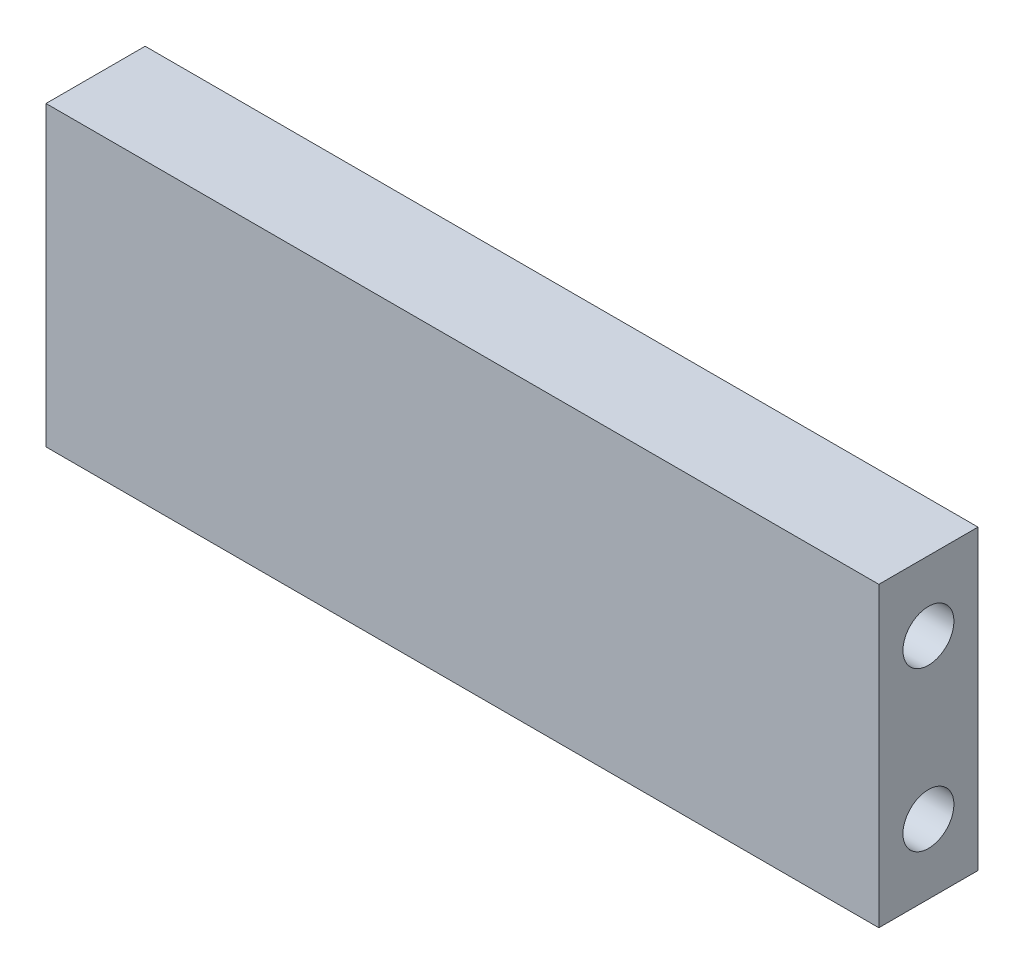
ISO-10303-21;
HEADER;
FILE_DESCRIPTION(('STEP AP214'),'2;1');
FILE_NAME('part.step','',(''),(''),'','','');
FILE_SCHEMA(('AUTOMOTIVE_DESIGN { 1 0 10303 214 1 1 1 1 }'));
ENDSEC;
DATA;
#1=APPLICATION_CONTEXT('core data for automotive mechanical design processes');
#2=APPLICATION_PROTOCOL_DEFINITION('international standard','automotive_design',2000,#1);
#3=PRODUCT_CONTEXT('',#1,'mechanical');
#4=PRODUCT('Part','Part','',(#3));
#5=PRODUCT_RELATED_PRODUCT_CATEGORY('part','',(#4));
#6=PRODUCT_DEFINITION_FORMATION('','',#4);
#7=PRODUCT_DEFINITION_CONTEXT('part definition',#1,'design');
#8=PRODUCT_DEFINITION('design','',#6,#7);
#9=PRODUCT_DEFINITION_SHAPE('','',#8);
#10=(LENGTH_UNIT() NAMED_UNIT(*) SI_UNIT(.MILLI.,.METRE.));
#11=(NAMED_UNIT(*) PLANE_ANGLE_UNIT() SI_UNIT($,.RADIAN.));
#12=(NAMED_UNIT(*) SI_UNIT($,.STERADIAN.) SOLID_ANGLE_UNIT());
#13=UNCERTAINTY_MEASURE_WITH_UNIT(LENGTH_MEASURE(1.E-05),#10,'distance_accuracy_value','');
#14=(GEOMETRIC_REPRESENTATION_CONTEXT(3) GLOBAL_UNCERTAINTY_ASSIGNED_CONTEXT((#13)) GLOBAL_UNIT_ASSIGNED_CONTEXT((#10,
#11,#12)) REPRESENTATION_CONTEXT('',''));
#15=CARTESIAN_POINT('',(0.,0.,0.));
#16=DIRECTION('',(0.,0.,1.));
#17=DIRECTION('',(1.,0.,0.));
#18=AXIS2_PLACEMENT_3D('',#15,#16,#17);
#19=CARTESIAN_POINT('',(53.34,-19.05,12.7));
#20=DIRECTION('',(-1.,0.,0.));
#21=DIRECTION('',(0.,0.,1.));
#22=AXIS2_PLACEMENT_3D('',#19,#20,#21);
#23=PLANE('',#22);
#24=CARTESIAN_POINT('',(53.34,-10.16,6.34999999999999));
#25=DIRECTION('',(1.,0.,0.));
#26=DIRECTION('',(0.,0.,1.));
#27=AXIS2_PLACEMENT_3D('',#24,#25,#26);
#28=CIRCLE('',#27,3.2639);
#29=CARTESIAN_POINT('',(53.34,-10.16,9.6139));
#30=VERTEX_POINT('',#29);
#31=EDGE_CURVE('E130',#30,#30,#28,.T.);
#32=ORIENTED_EDGE('',*,*,#31,.F.);
#33=EDGE_LOOP('',(#32));
#34=FACE_BOUND('',#33,.T.);
#35=CARTESIAN_POINT('',(53.34,10.16,6.35));
#36=DIRECTION('',(1.,0.,0.));
#37=DIRECTION('',(0.,0.,-1.));
#38=AXIS2_PLACEMENT_3D('',#35,#36,#37);
#39=CIRCLE('',#38,3.2639);
#40=CARTESIAN_POINT('',(53.34,10.16,3.0861));
#41=VERTEX_POINT('',#40);
#42=EDGE_CURVE('E124',#41,#41,#39,.T.);
#43=ORIENTED_EDGE('',*,*,#42,.F.);
#44=EDGE_LOOP('',(#43));
#45=FACE_BOUND('',#44,.T.);
#46=DIRECTION('',(0.,1.,0.));
#47=VECTOR('',#46,1.);
#48=CARTESIAN_POINT('',(53.34,-19.05,0.));
#49=LINE('',#48,#47);
#50=CARTESIAN_POINT('',(53.34,-19.05,0.));
#51=VERTEX_POINT('',#50);
#52=CARTESIAN_POINT('',(53.34,19.05,0.));
#53=VERTEX_POINT('',#52);
#54=EDGE_CURVE('E110',#51,#53,#49,.T.);
#55=ORIENTED_EDGE('',*,*,#54,.T.);
#56=DIRECTION('',(0.,0.,-1.));
#57=VECTOR('',#56,1.);
#58=CARTESIAN_POINT('',(53.34,19.05,12.7));
#59=LINE('',#58,#57);
#60=CARTESIAN_POINT('',(53.34,19.05,12.7));
#61=VERTEX_POINT('',#60);
#62=EDGE_CURVE('E13',#61,#53,#59,.T.);
#63=ORIENTED_EDGE('',*,*,#62,.F.);
#64=DIRECTION('',(0.,1.,0.));
#65=VECTOR('',#64,1.);
#66=CARTESIAN_POINT('',(53.34,-19.05,12.7));
#67=LINE('',#66,#65);
#68=CARTESIAN_POINT('',(53.34,-19.05,12.7));
#69=VERTEX_POINT('',#68);
#70=EDGE_CURVE('E98',#69,#61,#67,.T.);
#71=ORIENTED_EDGE('',*,*,#70,.F.);
#72=DIRECTION('',(0.,0.,-1.));
#73=VECTOR('',#72,1.);
#74=CARTESIAN_POINT('',(53.34,-19.05,12.7));
#75=LINE('',#74,#73);
#76=EDGE_CURVE('E106',#69,#51,#75,.T.);
#77=ORIENTED_EDGE('',*,*,#76,.T.);
#78=EDGE_LOOP('',(#55,#63,#71,#77));
#79=FACE_BOUND('',#78,.T.);
#80=ADVANCED_FACE('F47',(#34,#45,#79),#23,.F.);
#81=CARTESIAN_POINT('',(-53.34,19.05,12.7));
#82=DIRECTION('',(0.,-1.,0.));
#83=DIRECTION('',(0.,0.,-1.));
#84=AXIS2_PLACEMENT_3D('',#81,#82,#83);
#85=PLANE('',#84);
#86=DIRECTION('',(-1.,0.,0.));
#87=VECTOR('',#86,1.);
#88=CARTESIAN_POINT('',(-53.34,19.05,0.));
#89=LINE('',#88,#87);
#90=CARTESIAN_POINT('',(-53.34,19.05,0.));
#91=VERTEX_POINT('',#90);
#92=EDGE_CURVE('E102',#53,#91,#89,.T.);
#93=ORIENTED_EDGE('',*,*,#92,.T.);
#94=DIRECTION('',(0.,0.,-1.));
#95=VECTOR('',#94,1.);
#96=CARTESIAN_POINT('',(-53.34,19.05,12.7));
#97=LINE('',#96,#95);
#98=CARTESIAN_POINT('',(-53.34,19.05,12.7));
#99=VERTEX_POINT('',#98);
#100=EDGE_CURVE('E55',#99,#91,#97,.T.);
#101=ORIENTED_EDGE('',*,*,#100,.F.);
#102=DIRECTION('',(-1.,0.,0.));
#103=VECTOR('',#102,1.);
#104=CARTESIAN_POINT('',(-53.34,19.05,12.7));
#105=LINE('',#104,#103);
#106=EDGE_CURVE('E93',#61,#99,#105,.T.);
#107=ORIENTED_EDGE('',*,*,#106,.F.);
#108=ORIENTED_EDGE('',*,*,#62,.T.);
#109=EDGE_LOOP('',(#93,#101,#107,#108));
#110=FACE_BOUND('',#109,.T.);
#111=ADVANCED_FACE('F101',(#110),#85,.F.);
#112=CARTESIAN_POINT('',(-53.34,-19.05,12.7));
#113=DIRECTION('',(1.,0.,0.));
#114=DIRECTION('',(0.,0.,-1.));
#115=AXIS2_PLACEMENT_3D('',#112,#113,#114);
#116=PLANE('',#115);
#117=CARTESIAN_POINT('',(-53.34,-10.16,6.35000000000002));
#118=DIRECTION('',(-1.,0.,0.));
#119=DIRECTION('',(0.,0.,-1.));
#120=AXIS2_PLACEMENT_3D('',#117,#118,#119);
#121=CIRCLE('',#120,3.2639);
#122=CARTESIAN_POINT('',(-53.34,-10.16,3.08610000000002));
#123=VERTEX_POINT('',#122);
#124=EDGE_CURVE('E142',#123,#123,#121,.T.);
#125=ORIENTED_EDGE('',*,*,#124,.F.);
#126=EDGE_LOOP('',(#125));
#127=FACE_BOUND('',#126,.T.);
#128=CARTESIAN_POINT('',(-53.34,10.16,6.35));
#129=DIRECTION('',(-1.,0.,0.));
#130=DIRECTION('',(0.,0.,1.));
#131=AXIS2_PLACEMENT_3D('',#128,#129,#130);
#132=CIRCLE('',#131,3.2639);
#133=CARTESIAN_POINT('',(-53.34,10.16,9.6139));
#134=VERTEX_POINT('',#133);
#135=EDGE_CURVE('E136',#134,#134,#132,.T.);
#136=ORIENTED_EDGE('',*,*,#135,.F.);
#137=EDGE_LOOP('',(#136));
#138=FACE_BOUND('',#137,.T.);
#139=DIRECTION('',(0.,-1.,0.));
#140=VECTOR('',#139,1.);
#141=CARTESIAN_POINT('',(-53.34,-19.05,0.));
#142=LINE('',#141,#140);
#143=CARTESIAN_POINT('',(-53.34,-19.05,0.));
#144=VERTEX_POINT('',#143);
#145=EDGE_CURVE('E80',#91,#144,#142,.T.);
#146=ORIENTED_EDGE('',*,*,#145,.T.);
#147=DIRECTION('',(0.,0.,-1.));
#148=VECTOR('',#147,1.);
#149=CARTESIAN_POINT('',(-53.34,-19.05,12.7));
#150=LINE('',#149,#148);
#151=CARTESIAN_POINT('',(-53.34,-19.05,12.7));
#152=VERTEX_POINT('',#151);
#153=EDGE_CURVE('E103',#152,#144,#150,.T.);
#154=ORIENTED_EDGE('',*,*,#153,.F.);
#155=DIRECTION('',(0.,-1.,0.));
#156=VECTOR('',#155,1.);
#157=CARTESIAN_POINT('',(-53.34,-19.05,12.7));
#158=LINE('',#157,#156);
#159=EDGE_CURVE('E96',#99,#152,#158,.T.);
#160=ORIENTED_EDGE('',*,*,#159,.F.);
#161=ORIENTED_EDGE('',*,*,#100,.T.);
#162=EDGE_LOOP('',(#146,#154,#160,#161));
#163=FACE_BOUND('',#162,.T.);
#164=ADVANCED_FACE('F104',(#127,#138,#163),#116,.F.);
#165=CARTESIAN_POINT('',(-53.34,-19.05,12.7));
#166=DIRECTION('',(0.,1.,0.));
#167=DIRECTION('',(0.,0.,1.));
#168=AXIS2_PLACEMENT_3D('',#165,#166,#167);
#169=PLANE('',#168);
#170=DIRECTION('',(1.,0.,0.));
#171=VECTOR('',#170,1.);
#172=CARTESIAN_POINT('',(-53.34,-19.05,0.));
#173=LINE('',#172,#171);
#174=EDGE_CURVE('E86',#144,#51,#173,.T.);
#175=ORIENTED_EDGE('',*,*,#174,.T.);
#176=ORIENTED_EDGE('',*,*,#76,.F.);
#177=DIRECTION('',(1.,0.,0.));
#178=VECTOR('',#177,1.);
#179=CARTESIAN_POINT('',(-53.34,-19.05,12.7));
#180=LINE('',#179,#178);
#181=EDGE_CURVE('E63',#152,#69,#180,.T.);
#182=ORIENTED_EDGE('',*,*,#181,.F.);
#183=ORIENTED_EDGE('',*,*,#153,.T.);
#184=EDGE_LOOP('',(#175,#176,#182,#183));
#185=FACE_BOUND('',#184,.T.);
#186=ADVANCED_FACE('F118',(#185),#169,.F.);
#187=CARTESIAN_POINT('',(0.,0.,12.7));
#188=DIRECTION('',(0.,0.,-1.));
#189=DIRECTION('',(-1.,0.,0.));
#190=AXIS2_PLACEMENT_3D('',#187,#188,#189);
#191=PLANE('',#190);
#192=ORIENTED_EDGE('',*,*,#70,.T.);
#193=ORIENTED_EDGE('',*,*,#106,.T.);
#194=ORIENTED_EDGE('',*,*,#159,.T.);
#195=ORIENTED_EDGE('',*,*,#181,.T.);
#196=EDGE_LOOP('',(#192,#193,#194,#195));
#197=FACE_BOUND('',#196,.T.);
#198=ADVANCED_FACE('F94',(#197),#191,.F.);
#199=CARTESIAN_POINT('',(0.,0.,0.));
#200=DIRECTION('',(0.,0.,-1.));
#201=DIRECTION('',(-1.,0.,0.));
#202=AXIS2_PLACEMENT_3D('',#199,#200,#201);
#203=PLANE('',#202);
#204=ORIENTED_EDGE('',*,*,#54,.F.);
#205=ORIENTED_EDGE('',*,*,#174,.F.);
#206=ORIENTED_EDGE('',*,*,#145,.F.);
#207=ORIENTED_EDGE('',*,*,#92,.F.);
#208=EDGE_LOOP('',(#204,#205,#206,#207));
#209=FACE_BOUND('',#208,.T.);
#210=ADVANCED_FACE('F121',(#209),#203,.T.);
#211=CARTESIAN_POINT('',(31.115,10.16,6.35));
#212=DIRECTION('',(1.,0.,0.));
#213=DIRECTION('',(0.,0.,-1.));
#214=AXIS2_PLACEMENT_3D('',#211,#212,#213);
#215=CYLINDRICAL_SURFACE('',#214,3.2639);
#216=CARTESIAN_POINT('',(31.115,10.16,6.35));
#217=DIRECTION('',(1.,0.,0.));
#218=DIRECTION('',(0.,0.,-1.));
#219=AXIS2_PLACEMENT_3D('',#216,#217,#218);
#220=CIRCLE('',#219,3.2639);
#221=CARTESIAN_POINT('',(31.115,10.16,3.0861));
#222=VERTEX_POINT('',#221);
#223=EDGE_CURVE('E113',#222,#222,#220,.T.);
#224=ORIENTED_EDGE('',*,*,#223,.F.);
#225=EDGE_LOOP('',(#224));
#226=FACE_BOUND('',#225,.T.);
#227=ORIENTED_EDGE('',*,*,#42,.T.);
#228=EDGE_LOOP('',(#227));
#229=FACE_BOUND('',#228,.T.);
#230=ADVANCED_FACE('F186',(#226,#229),#215,.F.);
#231=CARTESIAN_POINT('',(31.115,10.16,6.35));
#232=DIRECTION('',(1.,0.,0.));
#233=DIRECTION('',(0.,0.,-1.));
#234=AXIS2_PLACEMENT_3D('',#231,#232,#233);
#235=PLANE('',#234);
#236=ORIENTED_EDGE('',*,*,#223,.T.);
#237=EDGE_LOOP('',(#236));
#238=FACE_BOUND('',#237,.T.);
#239=ADVANCED_FACE('F188',(#238),#235,.T.);
#240=CARTESIAN_POINT('',(31.115,-10.16,6.34999999999999));
#241=DIRECTION('',(1.,0.,0.));
#242=DIRECTION('',(0.,0.,-1.));
#243=AXIS2_PLACEMENT_3D('',#240,#241,#242);
#244=CYLINDRICAL_SURFACE('',#243,3.2639);
#245=CARTESIAN_POINT('',(31.115,-10.16,6.34999999999999));
#246=DIRECTION('',(1.,0.,0.));
#247=DIRECTION('',(0.,0.,1.));
#248=AXIS2_PLACEMENT_3D('',#245,#246,#247);
#249=CIRCLE('',#248,3.2639);
#250=CARTESIAN_POINT('',(31.115,-10.16,9.6139));
#251=VERTEX_POINT('',#250);
#252=EDGE_CURVE('E127',#251,#251,#249,.T.);
#253=ORIENTED_EDGE('',*,*,#252,.F.);
#254=EDGE_LOOP('',(#253));
#255=FACE_BOUND('',#254,.T.);
#256=ORIENTED_EDGE('',*,*,#31,.T.);
#257=EDGE_LOOP('',(#256));
#258=FACE_BOUND('',#257,.T.);
#259=ADVANCED_FACE('F173',(#255,#258),#244,.F.);
#260=CARTESIAN_POINT('',(31.115,-10.16,6.34999999999999));
#261=DIRECTION('',(-1.,0.,0.));
#262=DIRECTION('',(0.,0.,1.));
#263=AXIS2_PLACEMENT_3D('',#260,#261,#262);
#264=PLANE('',#263);
#265=ORIENTED_EDGE('',*,*,#252,.T.);
#266=EDGE_LOOP('',(#265));
#267=FACE_BOUND('',#266,.T.);
#268=ADVANCED_FACE('F164',(#267),#264,.F.);
#269=CARTESIAN_POINT('',(-31.115,10.16,6.35));
#270=DIRECTION('',(-1.,0.,0.));
#271=DIRECTION('',(0.,0.,1.));
#272=AXIS2_PLACEMENT_3D('',#269,#270,#271);
#273=CYLINDRICAL_SURFACE('',#272,3.2639);
#274=CARTESIAN_POINT('',(-31.115,10.16,6.35));
#275=DIRECTION('',(-1.,0.,0.));
#276=DIRECTION('',(0.,0.,1.));
#277=AXIS2_PLACEMENT_3D('',#274,#275,#276);
#278=CIRCLE('',#277,3.2639);
#279=CARTESIAN_POINT('',(-31.115,10.16,9.6139));
#280=VERTEX_POINT('',#279);
#281=EDGE_CURVE('E133',#280,#280,#278,.T.);
#282=ORIENTED_EDGE('',*,*,#281,.F.);
#283=EDGE_LOOP('',(#282));
#284=FACE_BOUND('',#283,.T.);
#285=ORIENTED_EDGE('',*,*,#135,.T.);
#286=EDGE_LOOP('',(#285));
#287=FACE_BOUND('',#286,.T.);
#288=ADVANCED_FACE('F162',(#284,#287),#273,.F.);
#289=CARTESIAN_POINT('',(-31.115,10.16,6.35));
#290=DIRECTION('',(-1.,0.,0.));
#291=DIRECTION('',(0.,0.,1.));
#292=AXIS2_PLACEMENT_3D('',#289,#290,#291);
#293=PLANE('',#292);
#294=ORIENTED_EDGE('',*,*,#281,.T.);
#295=EDGE_LOOP('',(#294));
#296=FACE_BOUND('',#295,.T.);
#297=ADVANCED_FACE('F153',(#296),#293,.T.);
#298=CARTESIAN_POINT('',(-31.115,-10.16,6.35000000000002));
#299=DIRECTION('',(-1.,0.,0.));
#300=DIRECTION('',(0.,0.,1.));
#301=AXIS2_PLACEMENT_3D('',#298,#299,#300);
#302=CYLINDRICAL_SURFACE('',#301,3.2639);
#303=CARTESIAN_POINT('',(-31.115,-10.16,6.35000000000002));
#304=DIRECTION('',(-1.,0.,0.));
#305=DIRECTION('',(0.,0.,-1.));
#306=AXIS2_PLACEMENT_3D('',#303,#304,#305);
#307=CIRCLE('',#306,3.2639);
#308=CARTESIAN_POINT('',(-31.115,-10.16,3.08610000000002));
#309=VERTEX_POINT('',#308);
#310=EDGE_CURVE('E139',#309,#309,#307,.T.);
#311=ORIENTED_EDGE('',*,*,#310,.F.);
#312=EDGE_LOOP('',(#311));
#313=FACE_BOUND('',#312,.T.);
#314=ORIENTED_EDGE('',*,*,#124,.T.);
#315=EDGE_LOOP('',(#314));
#316=FACE_BOUND('',#315,.T.);
#317=ADVANCED_FACE('F150',(#313,#316),#302,.F.);
#318=CARTESIAN_POINT('',(-31.115,-10.16,6.35000000000002));
#319=DIRECTION('',(1.,0.,0.));
#320=DIRECTION('',(0.,0.,-1.));
#321=AXIS2_PLACEMENT_3D('',#318,#319,#320);
#322=PLANE('',#321);
#323=ORIENTED_EDGE('',*,*,#310,.T.);
#324=EDGE_LOOP('',(#323));
#325=FACE_BOUND('',#324,.T.);
#326=ADVANCED_FACE('F148',(#325),#322,.F.);
#327=CLOSED_SHELL('',(#80,#111,#164,#186,#198,#210,#230,#239,#259,#268,#288,#297,#317,#326));
#328=MANIFOLD_SOLID_BREP('B2',#327);
#329=ADVANCED_BREP_SHAPE_REPRESENTATION('',(#18,#328),#14);
#330=SHAPE_DEFINITION_REPRESENTATION(#9,#329);
ENDSEC;
END-ISO-10303-21;
